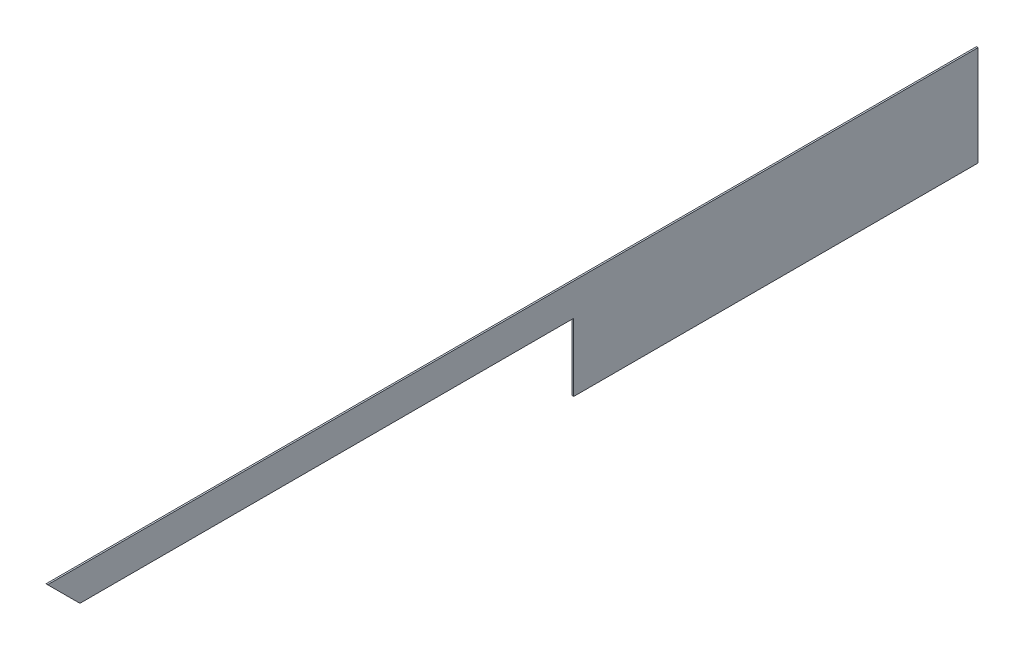
ISO-10303-21;
HEADER;
FILE_DESCRIPTION(('STEP AP214'),'2;1');
FILE_NAME('part.step','',(''),(''),'','','');
FILE_SCHEMA(('AUTOMOTIVE_DESIGN { 1 0 10303 214 1 1 1 1 }'));
ENDSEC;
DATA;
#1=APPLICATION_CONTEXT('core data for automotive mechanical design processes');
#2=APPLICATION_PROTOCOL_DEFINITION('international standard','automotive_design',2000,#1);
#3=PRODUCT_CONTEXT('',#1,'mechanical');
#4=PRODUCT('Part','Part','',(#3));
#5=PRODUCT_RELATED_PRODUCT_CATEGORY('part','',(#4));
#6=PRODUCT_DEFINITION_FORMATION('','',#4);
#7=PRODUCT_DEFINITION_CONTEXT('part definition',#1,'design');
#8=PRODUCT_DEFINITION('design','',#6,#7);
#9=PRODUCT_DEFINITION_SHAPE('','',#8);
#10=(LENGTH_UNIT() NAMED_UNIT(*) SI_UNIT(.MILLI.,.METRE.));
#11=(NAMED_UNIT(*) PLANE_ANGLE_UNIT() SI_UNIT($,.RADIAN.));
#12=(NAMED_UNIT(*) SI_UNIT($,.STERADIAN.) SOLID_ANGLE_UNIT());
#13=UNCERTAINTY_MEASURE_WITH_UNIT(LENGTH_MEASURE(1.E-05),#10,'distance_accuracy_value','');
#14=(GEOMETRIC_REPRESENTATION_CONTEXT(3) GLOBAL_UNCERTAINTY_ASSIGNED_CONTEXT((#13)) GLOBAL_UNIT_ASSIGNED_CONTEXT((#10,
#11,#12)) REPRESENTATION_CONTEXT('',''));
#15=CARTESIAN_POINT('',(0.,0.,0.));
#16=DIRECTION('',(0.,0.,1.));
#17=DIRECTION('',(1.,0.,0.));
#18=AXIS2_PLACEMENT_3D('',#15,#16,#17);
#19=CARTESIAN_POINT('',(1.,31.0000000000042,-288.35));
#20=DIRECTION('',(0.,0.,1.));
#21=DIRECTION('',(1.,0.,0.));
#22=AXIS2_PLACEMENT_3D('',#19,#20,#21);
#23=PLANE('',#22);
#24=DIRECTION('',(0.,1.,0.));
#25=VECTOR('',#24,1.);
#26=CARTESIAN_POINT('',(0.,31.0000000000042,-288.35));
#27=LINE('',#26,#25);
#28=CARTESIAN_POINT('',(0.,-31.0000000000041,-288.35));
#29=VERTEX_POINT('',#28);
#30=CARTESIAN_POINT('',(0.,31.0000000000042,-288.35));
#31=VERTEX_POINT('',#30);
#32=EDGE_CURVE('E127',#29,#31,#27,.T.);
#33=ORIENTED_EDGE('',*,*,#32,.T.);
#34=DIRECTION('',(-1.,0.,0.));
#35=VECTOR('',#34,1.);
#36=CARTESIAN_POINT('',(1.,31.0000000000042,-288.35));
#37=LINE('',#36,#35);
#38=CARTESIAN_POINT('',(1.,31.0000000000042,-288.35));
#39=VERTEX_POINT('',#38);
#40=EDGE_CURVE('E11',#39,#31,#37,.T.);
#41=ORIENTED_EDGE('',*,*,#40,.F.);
#42=DIRECTION('',(0.,1.,0.));
#43=VECTOR('',#42,1.);
#44=CARTESIAN_POINT('',(1.,31.0000000000042,-288.35));
#45=LINE('',#44,#43);
#46=CARTESIAN_POINT('',(1.,-31.0000000000041,-288.35));
#47=VERTEX_POINT('',#46);
#48=EDGE_CURVE('E144',#47,#39,#45,.T.);
#49=ORIENTED_EDGE('',*,*,#48,.F.);
#50=DIRECTION('',(-1.,0.,0.));
#51=VECTOR('',#50,1.);
#52=CARTESIAN_POINT('',(1.,-31.0000000000041,-288.35));
#53=LINE('',#52,#51);
#54=EDGE_CURVE('E123',#47,#29,#53,.T.);
#55=ORIENTED_EDGE('',*,*,#54,.T.);
#56=EDGE_LOOP('',(#33,#41,#49,#55));
#57=FACE_BOUND('',#56,.T.);
#58=ADVANCED_FACE('F39',(#57),#23,.F.);
#59=CARTESIAN_POINT('',(1.,31.0000000000042,-288.35));
#60=DIRECTION('',(0.,-1.,0.));
#61=DIRECTION('',(0.,0.,-1.));
#62=AXIS2_PLACEMENT_3D('',#59,#60,#61);
#63=PLANE('',#62);
#64=DIRECTION('',(0.,0.,1.));
#65=VECTOR('',#64,1.);
#66=CARTESIAN_POINT('',(0.,31.0000000000042,-288.35));
#67=LINE('',#66,#65);
#68=CARTESIAN_POINT('',(0.,31.0000000000041,288.35));
#69=VERTEX_POINT('',#68);
#70=EDGE_CURVE('E131',#31,#69,#67,.T.);
#71=ORIENTED_EDGE('',*,*,#70,.T.);
#72=DIRECTION('',(-1.,0.,0.));
#73=VECTOR('',#72,1.);
#74=CARTESIAN_POINT('',(1.,31.0000000000041,288.35));
#75=LINE('',#74,#73);
#76=CARTESIAN_POINT('',(1.,31.0000000000041,288.35));
#77=VERTEX_POINT('',#76);
#78=EDGE_CURVE('E48',#77,#69,#75,.T.);
#79=ORIENTED_EDGE('',*,*,#78,.F.);
#80=DIRECTION('',(0.,0.,1.));
#81=VECTOR('',#80,1.);
#82=CARTESIAN_POINT('',(1.,31.0000000000042,-288.35));
#83=LINE('',#82,#81);
#84=EDGE_CURVE('E93',#39,#77,#83,.T.);
#85=ORIENTED_EDGE('',*,*,#84,.F.);
#86=ORIENTED_EDGE('',*,*,#40,.T.);
#87=EDGE_LOOP('',(#71,#79,#85,#86));
#88=FACE_BOUND('',#87,.T.);
#89=ADVANCED_FACE('F172',(#88),#63,.F.);
#90=CARTESIAN_POINT('',(1.,10.9999999999958,268.317715349357));
#91=DIRECTION('',(0.,0.707676808175922,-0.706536294304786));
#92=DIRECTION('',(0.,0.706536294304786,0.707676808175922));
#93=AXIS2_PLACEMENT_3D('',#90,#91,#92);
#94=PLANE('',#93);
#95=DIRECTION('',(0.,-0.706536294304786,-0.707676808175922));
#96=VECTOR('',#95,1.);
#97=CARTESIAN_POINT('',(0.,10.9999999999958,268.317715349357));
#98=LINE('',#97,#96);
#99=CARTESIAN_POINT('',(0.,10.9999999999958,268.317715349357));
#100=VERTEX_POINT('',#99);
#101=EDGE_CURVE('E134',#69,#100,#98,.T.);
#102=ORIENTED_EDGE('',*,*,#101,.T.);
#103=DIRECTION('',(-1.,0.,0.));
#104=VECTOR('',#103,1.);
#105=CARTESIAN_POINT('',(1.,10.9999999999958,268.317715349357));
#106=LINE('',#105,#104);
#107=CARTESIAN_POINT('',(1.,10.9999999999958,268.317715349357));
#108=VERTEX_POINT('',#107);
#109=EDGE_CURVE('E116',#108,#100,#106,.T.);
#110=ORIENTED_EDGE('',*,*,#109,.F.);
#111=DIRECTION('',(0.,-0.706536294304786,-0.707676808175922));
#112=VECTOR('',#111,1.);
#113=CARTESIAN_POINT('',(1.,10.9999999999958,268.317715349357));
#114=LINE('',#113,#112);
#115=EDGE_CURVE('E106',#77,#108,#114,.T.);
#116=ORIENTED_EDGE('',*,*,#115,.F.);
#117=ORIENTED_EDGE('',*,*,#78,.T.);
#118=EDGE_LOOP('',(#102,#110,#116,#117));
#119=FACE_BOUND('',#118,.T.);
#120=ADVANCED_FACE('F154',(#119),#94,.F.);
#121=CARTESIAN_POINT('',(1.,10.9999999999958,-37.75));
#122=DIRECTION('',(0.,1.,0.));
#123=DIRECTION('',(0.,0.,1.));
#124=AXIS2_PLACEMENT_3D('',#121,#122,#123);
#125=PLANE('',#124);
#126=DIRECTION('',(0.,0.,-1.));
#127=VECTOR('',#126,1.);
#128=CARTESIAN_POINT('',(0.,10.9999999999958,-37.75));
#129=LINE('',#128,#127);
#130=CARTESIAN_POINT('',(0.,10.9999999999958,-37.75));
#131=VERTEX_POINT('',#130);
#132=EDGE_CURVE('E114',#100,#131,#129,.T.);
#133=ORIENTED_EDGE('',*,*,#132,.T.);
#134=DIRECTION('',(-1.,0.,0.));
#135=VECTOR('',#134,1.);
#136=CARTESIAN_POINT('',(1.,10.9999999999958,-37.75));
#137=LINE('',#136,#135);
#138=CARTESIAN_POINT('',(1.,10.9999999999958,-37.75));
#139=VERTEX_POINT('',#138);
#140=EDGE_CURVE('E112',#139,#131,#137,.T.);
#141=ORIENTED_EDGE('',*,*,#140,.F.);
#142=DIRECTION('',(0.,0.,-1.));
#143=VECTOR('',#142,1.);
#144=CARTESIAN_POINT('',(1.,10.9999999999958,261.282205756996));
#145=LINE('',#144,#143);
#146=EDGE_CURVE('E100',#108,#139,#145,.T.);
#147=ORIENTED_EDGE('',*,*,#146,.F.);
#148=ORIENTED_EDGE('',*,*,#109,.T.);
#149=EDGE_LOOP('',(#133,#141,#147,#148));
#150=FACE_BOUND('',#149,.T.);
#151=ADVANCED_FACE('F113',(#150),#125,.F.);
#152=CARTESIAN_POINT('',(1.,-31.0000000000042,-37.75));
#153=DIRECTION('',(0.,0.,-1.));
#154=DIRECTION('',(-1.,0.,0.));
#155=AXIS2_PLACEMENT_3D('',#152,#153,#154);
#156=PLANE('',#155);
#157=DIRECTION('',(0.,-1.,0.));
#158=VECTOR('',#157,1.);
#159=CARTESIAN_POINT('',(0.,-31.0000000000042,-37.75));
#160=LINE('',#159,#158);
#161=CARTESIAN_POINT('',(0.,-31.0000000000042,-37.75));
#162=VERTEX_POINT('',#161);
#163=EDGE_CURVE('E79',#131,#162,#160,.T.);
#164=ORIENTED_EDGE('',*,*,#163,.T.);
#165=DIRECTION('',(-1.,0.,0.));
#166=VECTOR('',#165,1.);
#167=CARTESIAN_POINT('',(1.,-31.0000000000042,-37.75));
#168=LINE('',#167,#166);
#169=CARTESIAN_POINT('',(1.,-31.0000000000042,-37.75));
#170=VERTEX_POINT('',#169);
#171=EDGE_CURVE('E117',#170,#162,#168,.T.);
#172=ORIENTED_EDGE('',*,*,#171,.F.);
#173=DIRECTION('',(0.,-1.,0.));
#174=VECTOR('',#173,1.);
#175=CARTESIAN_POINT('',(1.,-31.0000000000042,-37.75));
#176=LINE('',#175,#174);
#177=EDGE_CURVE('E104',#139,#170,#176,.T.);
#178=ORIENTED_EDGE('',*,*,#177,.F.);
#179=ORIENTED_EDGE('',*,*,#140,.T.);
#180=EDGE_LOOP('',(#164,#172,#178,#179));
#181=FACE_BOUND('',#180,.T.);
#182=ADVANCED_FACE('F119',(#181),#156,.F.);
#183=CARTESIAN_POINT('',(1.,-31.0000000000041,-288.35));
#184=DIRECTION('',(0.,1.,0.));
#185=DIRECTION('',(0.,0.,1.));
#186=AXIS2_PLACEMENT_3D('',#183,#184,#185);
#187=PLANE('',#186);
#188=DIRECTION('',(0.,0.,-1.));
#189=VECTOR('',#188,1.);
#190=CARTESIAN_POINT('',(0.,-31.0000000000041,-288.35));
#191=LINE('',#190,#189);
#192=EDGE_CURVE('E85',#162,#29,#191,.T.);
#193=ORIENTED_EDGE('',*,*,#192,.T.);
#194=ORIENTED_EDGE('',*,*,#54,.F.);
#195=DIRECTION('',(0.,0.,-1.));
#196=VECTOR('',#195,1.);
#197=CARTESIAN_POINT('',(1.,-31.0000000000041,-288.35));
#198=LINE('',#197,#196);
#199=EDGE_CURVE('E56',#170,#47,#198,.T.);
#200=ORIENTED_EDGE('',*,*,#199,.F.);
#201=ORIENTED_EDGE('',*,*,#171,.T.);
#202=EDGE_LOOP('',(#193,#194,#200,#201));
#203=FACE_BOUND('',#202,.T.);
#204=ADVANCED_FACE('F161',(#203),#187,.F.);
#205=CARTESIAN_POINT('',(1.,0.,0.));
#206=DIRECTION('',(-1.,0.,0.));
#207=DIRECTION('',(0.,0.,1.));
#208=AXIS2_PLACEMENT_3D('',#205,#206,#207);
#209=PLANE('',#208);
#210=ORIENTED_EDGE('',*,*,#48,.T.);
#211=ORIENTED_EDGE('',*,*,#84,.T.);
#212=ORIENTED_EDGE('',*,*,#115,.T.);
#213=ORIENTED_EDGE('',*,*,#146,.T.);
#214=ORIENTED_EDGE('',*,*,#177,.T.);
#215=ORIENTED_EDGE('',*,*,#199,.T.);
#216=EDGE_LOOP('',(#210,#211,#212,#213,#214,#215));
#217=FACE_BOUND('',#216,.T.);
#218=ADVANCED_FACE('F102',(#217),#209,.F.);
#219=CARTESIAN_POINT('',(0.,0.,0.));
#220=DIRECTION('',(-1.,0.,0.));
#221=DIRECTION('',(0.,0.,1.));
#222=AXIS2_PLACEMENT_3D('',#219,#220,#221);
#223=PLANE('',#222);
#224=ORIENTED_EDGE('',*,*,#32,.F.);
#225=ORIENTED_EDGE('',*,*,#192,.F.);
#226=ORIENTED_EDGE('',*,*,#163,.F.);
#227=ORIENTED_EDGE('',*,*,#132,.F.);
#228=ORIENTED_EDGE('',*,*,#101,.F.);
#229=ORIENTED_EDGE('',*,*,#70,.F.);
#230=EDGE_LOOP('',(#224,#225,#226,#227,#228,#229));
#231=FACE_BOUND('',#230,.T.);
#232=ADVANCED_FACE('F157',(#231),#223,.T.);
#233=CLOSED_SHELL('',(#58,#89,#120,#151,#182,#204,#218,#232));
#234=MANIFOLD_SOLID_BREP('B2',#233);
#235=ADVANCED_BREP_SHAPE_REPRESENTATION('',(#18,#234),#14);
#236=SHAPE_DEFINITION_REPRESENTATION(#9,#235);
ENDSEC;
END-ISO-10303-21;
